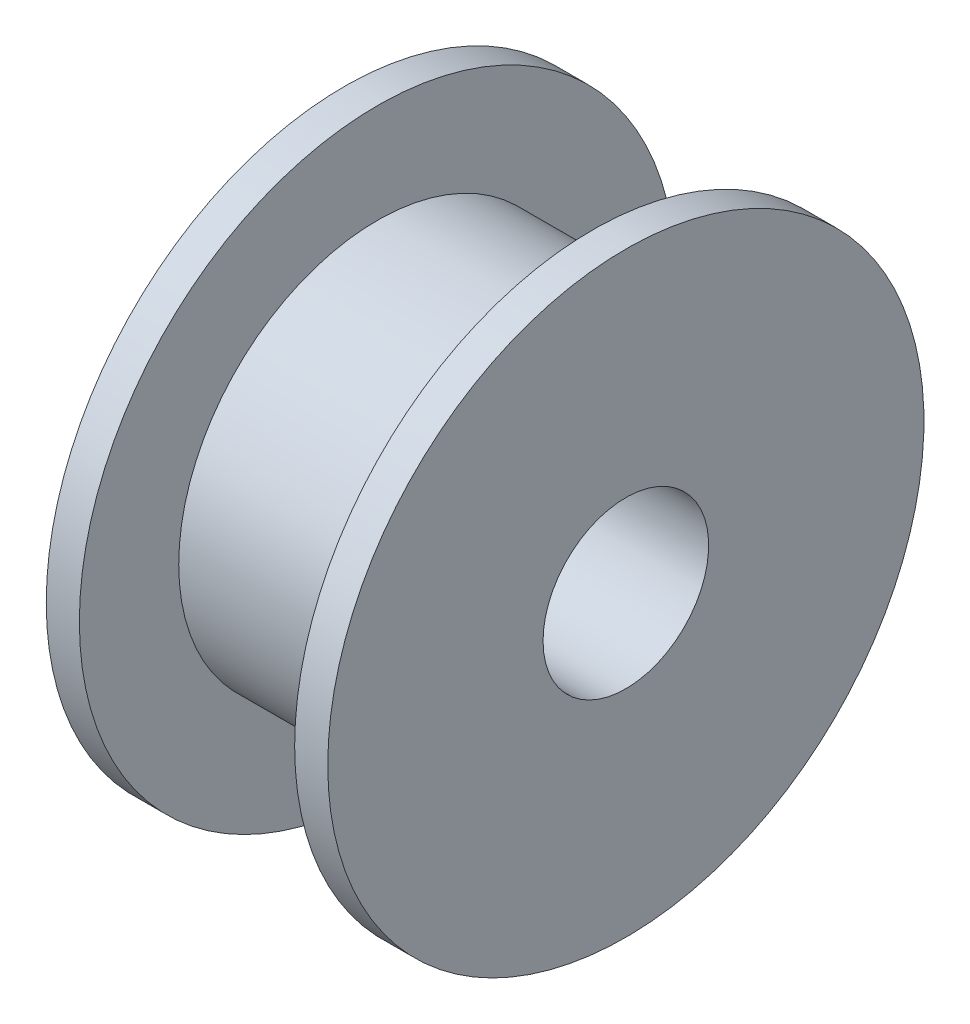
ISO-10303-21;
HEADER;
FILE_DESCRIPTION(('STEP AP214'),'2;1');
FILE_NAME('part.step','',(''),(''),'','','');
FILE_SCHEMA(('AUTOMOTIVE_DESIGN { 1 0 10303 214 1 1 1 1 }'));
ENDSEC;
DATA;
#1=APPLICATION_CONTEXT('core data for automotive mechanical design processes');
#2=APPLICATION_PROTOCOL_DEFINITION('international standard','automotive_design',2000,#1);
#3=PRODUCT_CONTEXT('',#1,'mechanical');
#4=PRODUCT('Part','Part','',(#3));
#5=PRODUCT_RELATED_PRODUCT_CATEGORY('part','',(#4));
#6=PRODUCT_DEFINITION_FORMATION('','',#4);
#7=PRODUCT_DEFINITION_CONTEXT('part definition',#1,'design');
#8=PRODUCT_DEFINITION('design','',#6,#7);
#9=PRODUCT_DEFINITION_SHAPE('','',#8);
#10=(LENGTH_UNIT() NAMED_UNIT(*) SI_UNIT(.MILLI.,.METRE.));
#11=(NAMED_UNIT(*) PLANE_ANGLE_UNIT() SI_UNIT($,.RADIAN.));
#12=(NAMED_UNIT(*) SI_UNIT($,.STERADIAN.) SOLID_ANGLE_UNIT());
#13=UNCERTAINTY_MEASURE_WITH_UNIT(LENGTH_MEASURE(1.E-05),#10,'distance_accuracy_value','');
#14=(GEOMETRIC_REPRESENTATION_CONTEXT(3) GLOBAL_UNCERTAINTY_ASSIGNED_CONTEXT((#13)) GLOBAL_UNIT_ASSIGNED_CONTEXT((#10,
#11,#12)) REPRESENTATION_CONTEXT('',''));
#15=CARTESIAN_POINT('',(0.,0.,0.));
#16=DIRECTION('',(0.,0.,1.));
#17=DIRECTION('',(1.,0.,0.));
#18=AXIS2_PLACEMENT_3D('',#15,#16,#17);
#19=CARTESIAN_POINT('',(-4.25,9.,0.));
#20=DIRECTION('',(1.,0.,0.));
#21=DIRECTION('',(0.,0.,-1.));
#22=AXIS2_PLACEMENT_3D('',#19,#20,#21);
#23=PLANE('',#22);
#24=CARTESIAN_POINT('',(-4.25,0.,0.));
#25=DIRECTION('',(-1.,0.,0.));
#26=DIRECTION('',(0.,0.,1.));
#27=AXIS2_PLACEMENT_3D('',#24,#25,#26);
#28=CIRCLE('',#27,2.5);
#29=CARTESIAN_POINT('',(-4.25,0.,2.5));
#30=VERTEX_POINT('',#29);
#31=EDGE_CURVE('E10',#30,#30,#28,.T.);
#32=ORIENTED_EDGE('',*,*,#31,.F.);
#33=EDGE_LOOP('',(#32));
#34=FACE_BOUND('',#33,.T.);
#35=CARTESIAN_POINT('',(-4.25,0.,0.));
#36=DIRECTION('',(-1.,0.,0.));
#37=DIRECTION('',(0.,0.,1.));
#38=AXIS2_PLACEMENT_3D('',#35,#36,#37);
#39=CIRCLE('',#38,9.);
#40=CARTESIAN_POINT('',(-4.25,0.,9.));
#41=VERTEX_POINT('',#40);
#42=EDGE_CURVE('E61',#41,#41,#39,.T.);
#43=ORIENTED_EDGE('',*,*,#42,.T.);
#44=EDGE_LOOP('',(#43));
#45=FACE_BOUND('',#44,.T.);
#46=ADVANCED_FACE('F33',(#34,#45),#23,.F.);
#47=CARTESIAN_POINT('',(-4.25,0.,0.));
#48=DIRECTION('',(-1.,0.,0.));
#49=DIRECTION('',(0.,0.,1.));
#50=AXIS2_PLACEMENT_3D('',#47,#48,#49);
#51=CYLINDRICAL_SURFACE('',#50,2.5);
#52=CARTESIAN_POINT('',(4.25,0.,0.));
#53=DIRECTION('',(-1.,0.,0.));
#54=DIRECTION('',(0.,0.,1.));
#55=AXIS2_PLACEMENT_3D('',#52,#53,#54);
#56=CIRCLE('',#55,2.5);
#57=CARTESIAN_POINT('',(4.25,0.,2.5));
#58=VERTEX_POINT('',#57);
#59=EDGE_CURVE('E39',#58,#58,#56,.T.);
#60=ORIENTED_EDGE('',*,*,#59,.F.);
#61=EDGE_LOOP('',(#60));
#62=FACE_BOUND('',#61,.T.);
#63=ORIENTED_EDGE('',*,*,#31,.T.);
#64=EDGE_LOOP('',(#63));
#65=FACE_BOUND('',#64,.T.);
#66=ADVANCED_FACE('F98',(#62,#65),#51,.F.);
#67=CARTESIAN_POINT('',(4.25,2.5,0.));
#68=DIRECTION('',(-1.,0.,0.));
#69=DIRECTION('',(0.,0.,1.));
#70=AXIS2_PLACEMENT_3D('',#67,#68,#69);
#71=PLANE('',#70);
#72=CARTESIAN_POINT('',(4.25,0.,0.));
#73=DIRECTION('',(-1.,0.,0.));
#74=DIRECTION('',(0.,0.,1.));
#75=AXIS2_PLACEMENT_3D('',#72,#73,#74);
#76=CIRCLE('',#75,9.00000000000001);
#77=CARTESIAN_POINT('',(4.25,0.,9.00000000000001));
#78=VERTEX_POINT('',#77);
#79=EDGE_CURVE('E43',#78,#78,#76,.T.);
#80=ORIENTED_EDGE('',*,*,#79,.F.);
#81=EDGE_LOOP('',(#80));
#82=FACE_BOUND('',#81,.T.);
#83=ORIENTED_EDGE('',*,*,#59,.T.);
#84=EDGE_LOOP('',(#83));
#85=FACE_BOUND('',#84,.T.);
#86=ADVANCED_FACE('F93',(#82,#85),#71,.F.);
#87=CARTESIAN_POINT('',(-4.25,0.,0.));
#88=DIRECTION('',(-1.,0.,0.));
#89=DIRECTION('',(0.,0.,1.));
#90=AXIS2_PLACEMENT_3D('',#87,#88,#89);
#91=CYLINDRICAL_SURFACE('',#90,9.);
#92=CARTESIAN_POINT('',(3.25,0.,0.));
#93=DIRECTION('',(-1.,0.,0.));
#94=DIRECTION('',(0.,0.,1.));
#95=AXIS2_PLACEMENT_3D('',#92,#93,#94);
#96=CIRCLE('',#95,9.);
#97=CARTESIAN_POINT('',(3.25,0.,9.));
#98=VERTEX_POINT('',#97);
#99=EDGE_CURVE('E47',#98,#98,#96,.T.);
#100=ORIENTED_EDGE('',*,*,#99,.F.);
#101=EDGE_LOOP('',(#100));
#102=FACE_BOUND('',#101,.T.);
#103=ORIENTED_EDGE('',*,*,#79,.T.);
#104=EDGE_LOOP('',(#103));
#105=FACE_BOUND('',#104,.T.);
#106=ADVANCED_FACE('F87',(#102,#105),#91,.T.);
#107=CARTESIAN_POINT('',(3.25,9.,0.));
#108=DIRECTION('',(1.,0.,0.));
#109=DIRECTION('',(0.,0.,-1.));
#110=AXIS2_PLACEMENT_3D('',#107,#108,#109);
#111=PLANE('',#110);
#112=CARTESIAN_POINT('',(3.25,0.,0.));
#113=DIRECTION('',(-1.,0.,0.));
#114=DIRECTION('',(0.,0.,1.));
#115=AXIS2_PLACEMENT_3D('',#112,#113,#114);
#116=CIRCLE('',#115,6.);
#117=CARTESIAN_POINT('',(3.25,0.,6.));
#118=VERTEX_POINT('',#117);
#119=EDGE_CURVE('E52',#118,#118,#116,.T.);
#120=ORIENTED_EDGE('',*,*,#119,.F.);
#121=EDGE_LOOP('',(#120));
#122=FACE_BOUND('',#121,.T.);
#123=ORIENTED_EDGE('',*,*,#99,.T.);
#124=EDGE_LOOP('',(#123));
#125=FACE_BOUND('',#124,.T.);
#126=ADVANCED_FACE('F81',(#122,#125),#111,.F.);
#127=CARTESIAN_POINT('',(-4.25,0.,0.));
#128=DIRECTION('',(-1.,0.,0.));
#129=DIRECTION('',(0.,0.,1.));
#130=AXIS2_PLACEMENT_3D('',#127,#128,#129);
#131=CYLINDRICAL_SURFACE('',#130,6.);
#132=CARTESIAN_POINT('',(-3.25,0.,0.));
#133=DIRECTION('',(-1.,0.,0.));
#134=DIRECTION('',(0.,0.,1.));
#135=AXIS2_PLACEMENT_3D('',#132,#133,#134);
#136=CIRCLE('',#135,6.);
#137=CARTESIAN_POINT('',(-3.25,0.,6.));
#138=VERTEX_POINT('',#137);
#139=EDGE_CURVE('E55',#138,#138,#136,.T.);
#140=ORIENTED_EDGE('',*,*,#139,.F.);
#141=EDGE_LOOP('',(#140));
#142=FACE_BOUND('',#141,.T.);
#143=ORIENTED_EDGE('',*,*,#119,.T.);
#144=EDGE_LOOP('',(#143));
#145=FACE_BOUND('',#144,.T.);
#146=ADVANCED_FACE('F75',(#142,#145),#131,.T.);
#147=CARTESIAN_POINT('',(-3.25,6.,0.));
#148=DIRECTION('',(-1.,0.,0.));
#149=DIRECTION('',(0.,0.,1.));
#150=AXIS2_PLACEMENT_3D('',#147,#148,#149);
#151=PLANE('',#150);
#152=CARTESIAN_POINT('',(-3.25,0.,0.));
#153=DIRECTION('',(-1.,0.,0.));
#154=DIRECTION('',(0.,0.,1.));
#155=AXIS2_PLACEMENT_3D('',#152,#153,#154);
#156=CIRCLE('',#155,9.);
#157=CARTESIAN_POINT('',(-3.25,0.,9.));
#158=VERTEX_POINT('',#157);
#159=EDGE_CURVE('E58',#158,#158,#156,.T.);
#160=ORIENTED_EDGE('',*,*,#159,.F.);
#161=EDGE_LOOP('',(#160));
#162=FACE_BOUND('',#161,.T.);
#163=ORIENTED_EDGE('',*,*,#139,.T.);
#164=EDGE_LOOP('',(#163));
#165=FACE_BOUND('',#164,.T.);
#166=ADVANCED_FACE('F69',(#162,#165),#151,.F.);
#167=CARTESIAN_POINT('',(-4.25,0.,0.));
#168=DIRECTION('',(-1.,0.,0.));
#169=DIRECTION('',(0.,0.,1.));
#170=AXIS2_PLACEMENT_3D('',#167,#168,#169);
#171=CYLINDRICAL_SURFACE('',#170,9.);
#172=ORIENTED_EDGE('',*,*,#42,.F.);
#173=EDGE_LOOP('',(#172));
#174=FACE_BOUND('',#173,.T.);
#175=ORIENTED_EDGE('',*,*,#159,.T.);
#176=EDGE_LOOP('',(#175));
#177=FACE_BOUND('',#176,.T.);
#178=ADVANCED_FACE('F66',(#174,#177),#171,.T.);
#179=CLOSED_SHELL('',(#46,#66,#86,#106,#126,#146,#166,#178));
#180=MANIFOLD_SOLID_BREP('B2',#179);
#181=ADVANCED_BREP_SHAPE_REPRESENTATION('',(#18,#180),#14);
#182=SHAPE_DEFINITION_REPRESENTATION(#9,#181);
ENDSEC;
END-ISO-10303-21;
